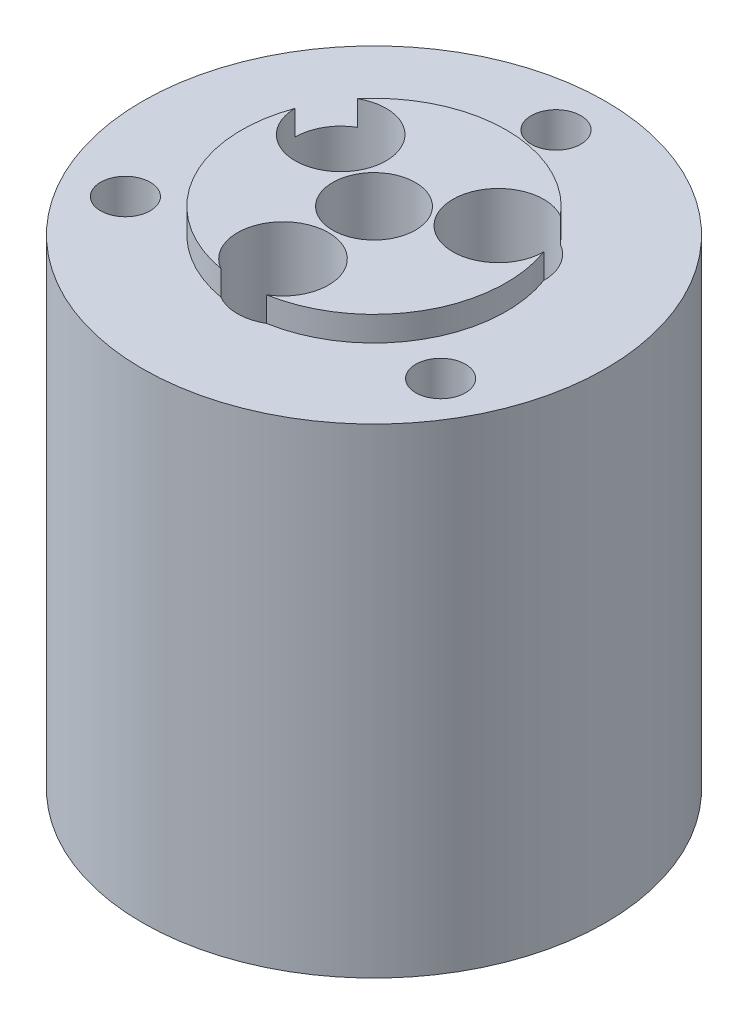
ISO-10303-21;
HEADER;
FILE_DESCRIPTION(('STEP AP214'),'2;1');
FILE_NAME('part.step','',(''),(''),'','','');
FILE_SCHEMA(('AUTOMOTIVE_DESIGN { 1 0 10303 214 1 1 1 1 }'));
ENDSEC;
DATA;
#1=APPLICATION_CONTEXT('core data for automotive mechanical design processes');
#2=APPLICATION_PROTOCOL_DEFINITION('international standard','automotive_design',2000,#1);
#3=PRODUCT_CONTEXT('',#1,'mechanical');
#4=PRODUCT('Part','Part','',(#3));
#5=PRODUCT_RELATED_PRODUCT_CATEGORY('part','',(#4));
#6=PRODUCT_DEFINITION_FORMATION('','',#4);
#7=PRODUCT_DEFINITION_CONTEXT('part definition',#1,'design');
#8=PRODUCT_DEFINITION('design','',#6,#7);
#9=PRODUCT_DEFINITION_SHAPE('','',#8);
#10=(LENGTH_UNIT() NAMED_UNIT(*) SI_UNIT(.MILLI.,.METRE.));
#11=(NAMED_UNIT(*) PLANE_ANGLE_UNIT() SI_UNIT($,.RADIAN.));
#12=(NAMED_UNIT(*) SI_UNIT($,.STERADIAN.) SOLID_ANGLE_UNIT());
#13=UNCERTAINTY_MEASURE_WITH_UNIT(LENGTH_MEASURE(1.E-05),#10,'distance_accuracy_value','');
#14=(GEOMETRIC_REPRESENTATION_CONTEXT(3) GLOBAL_UNCERTAINTY_ASSIGNED_CONTEXT((#13)) GLOBAL_UNIT_ASSIGNED_CONTEXT((#10,
#11,#12)) REPRESENTATION_CONTEXT('',''));
#15=CARTESIAN_POINT('',(0.,0.,0.));
#16=DIRECTION('',(0.,0.,1.));
#17=DIRECTION('',(1.,0.,0.));
#18=AXIS2_PLACEMENT_3D('',#15,#16,#17);
#19=CARTESIAN_POINT('',(0.,0.,0.));
#20=DIRECTION('',(0.,-1.,0.));
#21=DIRECTION('',(1.,0.,0.));
#22=AXIS2_PLACEMENT_3D('',#19,#20,#21);
#23=CYLINDRICAL_SURFACE('',#22,2.5);
#24=CARTESIAN_POINT('',(0.,32.,0.));
#25=DIRECTION('',(0.,-1.,0.));
#26=DIRECTION('',(1.,0.,0.));
#27=AXIS2_PLACEMENT_3D('',#24,#25,#26);
#28=CIRCLE('',#27,2.5);
#29=CARTESIAN_POINT('',(2.5,32.,0.));
#30=VERTEX_POINT('',#29);
#31=EDGE_CURVE('E108',#30,#30,#28,.T.);
#32=ORIENTED_EDGE('',*,*,#31,.F.);
#33=EDGE_LOOP('',(#32));
#34=FACE_BOUND('',#33,.T.);
#35=CARTESIAN_POINT('',(0.,8.,0.));
#36=DIRECTION('',(0.,-1.,0.));
#37=DIRECTION('',(1.,0.,0.));
#38=AXIS2_PLACEMENT_3D('',#35,#36,#37);
#39=CIRCLE('',#38,2.5);
#40=CARTESIAN_POINT('',(2.5,8.,0.));
#41=VERTEX_POINT('',#40);
#42=EDGE_CURVE('E177',#41,#41,#39,.T.);
#43=ORIENTED_EDGE('',*,*,#42,.T.);
#44=EDGE_LOOP('',(#43));
#45=FACE_BOUND('',#44,.T.);
#46=ADVANCED_FACE('F33',(#34,#45),#23,.F.);
#47=CARTESIAN_POINT('',(0.,-0.00100000000000339,5.5));
#48=DIRECTION('',(0.,1.,0.));
#49=DIRECTION('',(-1.,0.,0.));
#50=AXIS2_PLACEMENT_3D('',#47,#48,#49);
#51=CYLINDRICAL_SURFACE('',#50,1.5);
#52=CARTESIAN_POINT('',(0.,12.,5.5));
#53=DIRECTION('',(0.,-1.,0.));
#54=DIRECTION('',(1.,0.,0.));
#55=AXIS2_PLACEMENT_3D('',#52,#53,#54);
#56=CIRCLE('',#55,1.5);
#57=CARTESIAN_POINT('',(-1.5,12.,5.5));
#58=VERTEX_POINT('',#57);
#59=EDGE_CURVE('E156',#58,#58,#56,.T.);
#60=CARTESIAN_POINT('',(0.,8.,5.5));
#61=DIRECTION('',(0.,-1.,0.));
#62=DIRECTION('',(1.,0.,0.));
#63=AXIS2_PLACEMENT_3D('',#60,#61,#62);
#64=CIRCLE('',#63,1.5);
#65=CARTESIAN_POINT('',(-1.5,8.,5.5));
#66=VERTEX_POINT('',#65);
#67=EDGE_CURVE('E180',#66,#66,#64,.T.);
#68=CARTESIAN_POINT('',(-1.5,12.,5.5));
#69=CARTESIAN_POINT('',(-1.5,11.9583333333333,5.5));
#70=CARTESIAN_POINT('',(-1.5,11.9166666666667,5.5));
#71=CARTESIAN_POINT('',(-1.5,11.8333333333333,5.5));
#72=CARTESIAN_POINT('',(-1.5,11.7916666666667,5.5));
#73=CARTESIAN_POINT('',(-1.5,11.7083333333333,5.5));
#74=CARTESIAN_POINT('',(-1.5,11.6666666666667,5.5));
#75=CARTESIAN_POINT('',(-1.5,11.5833333333333,5.5));
#76=CARTESIAN_POINT('',(-1.5,11.5416666666667,5.5));
#77=CARTESIAN_POINT('',(-1.5,11.4583333333333,5.5));
#78=CARTESIAN_POINT('',(-1.5,11.4166666666667,5.5));
#79=CARTESIAN_POINT('',(-1.5,11.3333333333333,5.5));
#80=CARTESIAN_POINT('',(-1.5,11.2916666666667,5.5));
#81=CARTESIAN_POINT('',(-1.5,11.2083333333333,5.5));
#82=CARTESIAN_POINT('',(-1.5,11.1666666666667,5.5));
#83=CARTESIAN_POINT('',(-1.5,11.0833333333333,5.5));
#84=CARTESIAN_POINT('',(-1.5,11.0416666666667,5.5));
#85=CARTESIAN_POINT('',(-1.5,10.9583333333333,5.5));
#86=CARTESIAN_POINT('',(-1.5,10.9166666666667,5.5));
#87=CARTESIAN_POINT('',(-1.5,10.8333333333333,5.5));
#88=CARTESIAN_POINT('',(-1.5,10.7916666666667,5.5));
#89=CARTESIAN_POINT('',(-1.5,10.7083333333333,5.5));
#90=CARTESIAN_POINT('',(-1.5,10.6666666666667,5.5));
#91=CARTESIAN_POINT('',(-1.5,10.5833333333333,5.5));
#92=CARTESIAN_POINT('',(-1.5,10.5416666666667,5.5));
#93=CARTESIAN_POINT('',(-1.5,10.4583333333333,5.5));
#94=CARTESIAN_POINT('',(-1.5,10.4166666666667,5.5));
#95=CARTESIAN_POINT('',(-1.5,10.3333333333333,5.5));
#96=CARTESIAN_POINT('',(-1.5,10.2916666666667,5.5));
#97=CARTESIAN_POINT('',(-1.5,10.2083333333333,5.5));
#98=CARTESIAN_POINT('',(-1.5,10.1666666666667,5.5));
#99=CARTESIAN_POINT('',(-1.5,10.0833333333333,5.5));
#100=CARTESIAN_POINT('',(-1.5,10.0416666666667,5.5));
#101=CARTESIAN_POINT('',(-1.5,9.95833333333333,5.5));
#102=CARTESIAN_POINT('',(-1.5,9.91666666666667,5.5));
#103=CARTESIAN_POINT('',(-1.5,9.83333333333333,5.5));
#104=CARTESIAN_POINT('',(-1.5,9.79166666666667,5.5));
#105=CARTESIAN_POINT('',(-1.5,9.70833333333333,5.5));
#106=CARTESIAN_POINT('',(-1.5,9.66666666666667,5.5));
#107=CARTESIAN_POINT('',(-1.5,9.58333333333333,5.5));
#108=CARTESIAN_POINT('',(-1.5,9.54166666666667,5.5));
#109=CARTESIAN_POINT('',(-1.5,9.45833333333333,5.5));
#110=CARTESIAN_POINT('',(-1.5,9.41666666666667,5.5));
#111=CARTESIAN_POINT('',(-1.5,9.33333333333333,5.5));
#112=CARTESIAN_POINT('',(-1.5,9.29166666666667,5.5));
#113=CARTESIAN_POINT('',(-1.5,9.20833333333333,5.5));
#114=CARTESIAN_POINT('',(-1.5,9.16666666666667,5.5));
#115=CARTESIAN_POINT('',(-1.5,9.08333333333333,5.5));
#116=CARTESIAN_POINT('',(-1.5,9.04166666666667,5.5));
#117=CARTESIAN_POINT('',(-1.5,8.95833333333333,5.5));
#118=CARTESIAN_POINT('',(-1.5,8.91666666666667,5.5));
#119=CARTESIAN_POINT('',(-1.5,8.83333333333333,5.5));
#120=CARTESIAN_POINT('',(-1.5,8.79166666666667,5.5));
#121=CARTESIAN_POINT('',(-1.5,8.70833333333333,5.5));
#122=CARTESIAN_POINT('',(-1.5,8.66666666666667,5.5));
#123=CARTESIAN_POINT('',(-1.5,8.58333333333333,5.5));
#124=CARTESIAN_POINT('',(-1.5,8.54166666666667,5.5));
#125=CARTESIAN_POINT('',(-1.5,8.45833333333333,5.5));
#126=CARTESIAN_POINT('',(-1.5,8.41666666666667,5.5));
#127=CARTESIAN_POINT('',(-1.5,8.33333333333333,5.5));
#128=CARTESIAN_POINT('',(-1.5,8.29166666666667,5.5));
#129=CARTESIAN_POINT('',(-1.5,8.20833333333333,5.5));
#130=CARTESIAN_POINT('',(-1.5,8.16666666666667,5.5));
#131=CARTESIAN_POINT('',(-1.5,8.08333333333333,5.5));
#132=CARTESIAN_POINT('',(-1.5,8.04166666666667,5.5));
#133=CARTESIAN_POINT('',(-1.5,8.,5.5));
#134=B_SPLINE_CURVE_WITH_KNOTS('',3,(#68,#69,#70,#71,#72,#73,#74,#75,#76,#77,#78,#79,#80,#81,
#82,#83,#84,#85,#86,#87,#88,#89,#90,#91,#92,#93,#94,#95,#96,#97,#98,#99,#100,#101,#102,#103,
#104,#105,#106,#107,#108,#109,#110,#111,#112,#113,#114,#115,#116,#117,#118,#119,#120,#121,#122,
#123,#124,#125,#126,#127,#128,#129,#130,#131,#132,#133),.UNSPECIFIED.,.F.,.F.,(4,2,2,2,2,2,2,2,
2,2,2,2,2,2,2,2,2,2,2,2,2,2,2,2,2,2,2,2,2,2,2,2,4),(0.,0.125,0.25,0.375,0.5,0.625000000000001,
0.750000000000001,0.875000000000001,1.,1.125,1.25,1.375,1.5,1.625,1.75,1.875,2.,2.125,2.25,
2.375,2.5,2.625,2.75,2.875,3.,3.125,3.25,3.375,3.5,3.625,3.75,3.875,4.),.UNSPECIFIED.);
#135=EDGE_CURVE('BSEAM209',#58,#66,#134,.T.);
#136=ORIENTED_EDGE('',*,*,#59,.F.);
#137=ORIENTED_EDGE('',*,*,#67,.T.);
#138=ORIENTED_EDGE('',*,*,#135,.T.);
#139=ORIENTED_EDGE('',*,*,#135,.F.);
#140=EDGE_LOOP('',(#136,#138,#137,#139));
#141=FACE_BOUND('',#140,.T.);
#142=ADVANCED_FACE('F209',(#141),#51,.F.);
#143=CARTESIAN_POINT('',(4.76313972081473,-0.00100000000000273,-2.74999999999981));
#144=DIRECTION('',(0.,1.,0.));
#145=DIRECTION('',(-1.,0.,0.));
#146=AXIS2_PLACEMENT_3D('',#143,#144,#145);
#147=CYLINDRICAL_SURFACE('',#146,1.5);
#148=CARTESIAN_POINT('',(4.76313972081473,12.,-2.74999999999981));
#149=DIRECTION('',(0.,-1.,0.));
#150=DIRECTION('',(1.,0.,0.));
#151=AXIS2_PLACEMENT_3D('',#148,#149,#150);
#152=CIRCLE('',#151,1.5);
#153=CARTESIAN_POINT('',(3.26313972081473,12.,-2.74999999999981));
#154=VERTEX_POINT('',#153);
#155=EDGE_CURVE('E166',#154,#154,#152,.T.);
#156=CARTESIAN_POINT('',(4.76313972081473,8.,-2.74999999999981));
#157=DIRECTION('',(0.,-1.,0.));
#158=DIRECTION('',(1.,0.,0.));
#159=AXIS2_PLACEMENT_3D('',#156,#157,#158);
#160=CIRCLE('',#159,1.5);
#161=CARTESIAN_POINT('',(3.26313972081473,8.,-2.74999999999981));
#162=VERTEX_POINT('',#161);
#163=EDGE_CURVE('E183',#162,#162,#160,.T.);
#164=CARTESIAN_POINT('',(3.26313972081473,12.,-2.74999999999981));
#165=CARTESIAN_POINT('',(3.26313972081473,11.9583333333333,-2.74999999999981));
#166=CARTESIAN_POINT('',(3.26313972081473,11.9166666666667,-2.74999999999981));
#167=CARTESIAN_POINT('',(3.26313972081473,11.8333333333333,-2.74999999999981));
#168=CARTESIAN_POINT('',(3.26313972081473,11.7916666666667,-2.74999999999981));
#169=CARTESIAN_POINT('',(3.26313972081473,11.7083333333333,-2.74999999999981));
#170=CARTESIAN_POINT('',(3.26313972081473,11.6666666666667,-2.74999999999981));
#171=CARTESIAN_POINT('',(3.26313972081473,11.5833333333333,-2.74999999999981));
#172=CARTESIAN_POINT('',(3.26313972081473,11.5416666666667,-2.74999999999981));
#173=CARTESIAN_POINT('',(3.26313972081473,11.4583333333333,-2.74999999999981));
#174=CARTESIAN_POINT('',(3.26313972081473,11.4166666666667,-2.74999999999981));
#175=CARTESIAN_POINT('',(3.26313972081473,11.3333333333333,-2.74999999999981));
#176=CARTESIAN_POINT('',(3.26313972081473,11.2916666666667,-2.74999999999981));
#177=CARTESIAN_POINT('',(3.26313972081473,11.2083333333333,-2.74999999999981));
#178=CARTESIAN_POINT('',(3.26313972081473,11.1666666666667,-2.74999999999981));
#179=CARTESIAN_POINT('',(3.26313972081473,11.0833333333333,-2.74999999999981));
#180=CARTESIAN_POINT('',(3.26313972081473,11.0416666666667,-2.74999999999981));
#181=CARTESIAN_POINT('',(3.26313972081473,10.9583333333333,-2.74999999999981));
#182=CARTESIAN_POINT('',(3.26313972081473,10.9166666666667,-2.74999999999981));
#183=CARTESIAN_POINT('',(3.26313972081473,10.8333333333333,-2.74999999999981));
#184=CARTESIAN_POINT('',(3.26313972081473,10.7916666666667,-2.74999999999981));
#185=CARTESIAN_POINT('',(3.26313972081473,10.7083333333333,-2.74999999999981));
#186=CARTESIAN_POINT('',(3.26313972081473,10.6666666666667,-2.74999999999981));
#187=CARTESIAN_POINT('',(3.26313972081473,10.5833333333333,-2.74999999999981));
#188=CARTESIAN_POINT('',(3.26313972081473,10.5416666666667,-2.74999999999981));
#189=CARTESIAN_POINT('',(3.26313972081473,10.4583333333333,-2.74999999999981));
#190=CARTESIAN_POINT('',(3.26313972081473,10.4166666666667,-2.74999999999981));
#191=CARTESIAN_POINT('',(3.26313972081473,10.3333333333333,-2.74999999999981));
#192=CARTESIAN_POINT('',(3.26313972081473,10.2916666666667,-2.74999999999981));
#193=CARTESIAN_POINT('',(3.26313972081473,10.2083333333333,-2.74999999999981));
#194=CARTESIAN_POINT('',(3.26313972081473,10.1666666666667,-2.74999999999981));
#195=CARTESIAN_POINT('',(3.26313972081473,10.0833333333333,-2.74999999999981));
#196=CARTESIAN_POINT('',(3.26313972081473,10.0416666666667,-2.74999999999981));
#197=CARTESIAN_POINT('',(3.26313972081473,9.95833333333333,-2.74999999999981));
#198=CARTESIAN_POINT('',(3.26313972081473,9.91666666666667,-2.74999999999981));
#199=CARTESIAN_POINT('',(3.26313972081473,9.83333333333333,-2.74999999999981));
#200=CARTESIAN_POINT('',(3.26313972081473,9.79166666666667,-2.74999999999981));
#201=CARTESIAN_POINT('',(3.26313972081473,9.70833333333333,-2.74999999999981));
#202=CARTESIAN_POINT('',(3.26313972081473,9.66666666666667,-2.74999999999981));
#203=CARTESIAN_POINT('',(3.26313972081473,9.58333333333333,-2.74999999999981));
#204=CARTESIAN_POINT('',(3.26313972081473,9.54166666666667,-2.74999999999981));
#205=CARTESIAN_POINT('',(3.26313972081473,9.45833333333333,-2.74999999999981));
#206=CARTESIAN_POINT('',(3.26313972081473,9.41666666666667,-2.74999999999981));
#207=CARTESIAN_POINT('',(3.26313972081473,9.33333333333333,-2.74999999999981));
#208=CARTESIAN_POINT('',(3.26313972081473,9.29166666666667,-2.74999999999981));
#209=CARTESIAN_POINT('',(3.26313972081473,9.20833333333333,-2.74999999999981));
#210=CARTESIAN_POINT('',(3.26313972081473,9.16666666666667,-2.74999999999981));
#211=CARTESIAN_POINT('',(3.26313972081473,9.08333333333333,-2.74999999999981));
#212=CARTESIAN_POINT('',(3.26313972081473,9.04166666666667,-2.74999999999981));
#213=CARTESIAN_POINT('',(3.26313972081473,8.95833333333333,-2.74999999999981));
#214=CARTESIAN_POINT('',(3.26313972081473,8.91666666666667,-2.74999999999981));
#215=CARTESIAN_POINT('',(3.26313972081473,8.83333333333333,-2.74999999999981));
#216=CARTESIAN_POINT('',(3.26313972081473,8.79166666666667,-2.74999999999981));
#217=CARTESIAN_POINT('',(3.26313972081473,8.70833333333333,-2.74999999999981));
#218=CARTESIAN_POINT('',(3.26313972081473,8.66666666666667,-2.74999999999981));
#219=CARTESIAN_POINT('',(3.26313972081473,8.58333333333333,-2.74999999999981));
#220=CARTESIAN_POINT('',(3.26313972081473,8.54166666666667,-2.74999999999981));
#221=CARTESIAN_POINT('',(3.26313972081473,8.45833333333333,-2.74999999999981));
#222=CARTESIAN_POINT('',(3.26313972081473,8.41666666666667,-2.74999999999981));
#223=CARTESIAN_POINT('',(3.26313972081473,8.33333333333333,-2.74999999999981));
#224=CARTESIAN_POINT('',(3.26313972081473,8.29166666666667,-2.74999999999981));
#225=CARTESIAN_POINT('',(3.26313972081473,8.20833333333333,-2.74999999999981));
#226=CARTESIAN_POINT('',(3.26313972081473,8.16666666666667,-2.74999999999981));
#227=CARTESIAN_POINT('',(3.26313972081473,8.08333333333333,-2.74999999999981));
#228=CARTESIAN_POINT('',(3.26313972081473,8.04166666666667,-2.74999999999981));
#229=CARTESIAN_POINT('',(3.26313972081473,8.,-2.74999999999981));
#230=B_SPLINE_CURVE_WITH_KNOTS('',3,(#164,#165,#166,#167,#168,#169,#170,#171,#172,#173,#174,
#175,#176,#177,#178,#179,#180,#181,#182,#183,#184,#185,#186,#187,#188,#189,#190,#191,#192,#193,
#194,#195,#196,#197,#198,#199,#200,#201,#202,#203,#204,#205,#206,#207,#208,#209,#210,#211,#212,
#213,#214,#215,#216,#217,#218,#219,#220,#221,#222,#223,#224,#225,#226,#227,#228,#229),
.UNSPECIFIED.,.F.,.F.,(4,2,2,2,2,2,2,2,2,2,2,2,2,2,2,2,2,2,2,2,2,2,2,2,2,2,2,2,2,2,2,2,4),(0.,
0.125,0.25,0.375,0.5,0.625000000000001,0.750000000000001,0.875000000000001,1.,1.125,1.25,1.375,
1.5,1.625,1.75,1.875,2.,2.125,2.25,2.375,2.5,2.625,2.75,2.875,3.,3.125,3.25,3.375,3.5,3.625,
3.75,3.875,4.),.UNSPECIFIED.);
#231=EDGE_CURVE('BSEAM214',#154,#162,#230,.T.);
#232=ORIENTED_EDGE('',*,*,#155,.F.);
#233=ORIENTED_EDGE('',*,*,#163,.T.);
#234=ORIENTED_EDGE('',*,*,#231,.T.);
#235=ORIENTED_EDGE('',*,*,#231,.F.);
#236=EDGE_LOOP('',(#232,#234,#233,#235));
#237=FACE_BOUND('',#236,.T.);
#238=ADVANCED_FACE('F214',(#237),#147,.F.);
#239=CARTESIAN_POINT('',(-4.76313972081409,-0.00100000000000404,-2.75000000000019));
#240=DIRECTION('',(0.,1.,0.));
#241=DIRECTION('',(-1.,0.,0.));
#242=AXIS2_PLACEMENT_3D('',#239,#240,#241);
#243=CYLINDRICAL_SURFACE('',#242,1.5);
#244=CARTESIAN_POINT('',(-4.76313972081409,12.,-2.75000000000019));
#245=DIRECTION('',(0.,-1.,0.));
#246=DIRECTION('',(1.,0.,0.));
#247=AXIS2_PLACEMENT_3D('',#244,#245,#246);
#248=CIRCLE('',#247,1.5);
#249=CARTESIAN_POINT('',(-6.26313972081409,12.,-2.75000000000019));
#250=VERTEX_POINT('',#249);
#251=EDGE_CURVE('E92',#250,#250,#248,.T.);
#252=CARTESIAN_POINT('',(-4.76313972081409,8.,-2.75000000000019));
#253=DIRECTION('',(0.,-1.,0.));
#254=DIRECTION('',(1.,0.,0.));
#255=AXIS2_PLACEMENT_3D('',#252,#253,#254);
#256=CIRCLE('',#255,1.5);
#257=CARTESIAN_POINT('',(-6.26313972081409,8.,-2.75000000000019));
#258=VERTEX_POINT('',#257);
#259=EDGE_CURVE('E36',#258,#258,#256,.T.);
#260=CARTESIAN_POINT('',(-6.26313972081409,12.,-2.75000000000019));
#261=CARTESIAN_POINT('',(-6.26313972081409,11.9583333333333,-2.75000000000019));
#262=CARTESIAN_POINT('',(-6.26313972081409,11.9166666666667,-2.75000000000019));
#263=CARTESIAN_POINT('',(-6.26313972081409,11.8333333333333,-2.75000000000019));
#264=CARTESIAN_POINT('',(-6.26313972081409,11.7916666666667,-2.75000000000019));
#265=CARTESIAN_POINT('',(-6.26313972081409,11.7083333333333,-2.75000000000019));
#266=CARTESIAN_POINT('',(-6.26313972081409,11.6666666666667,-2.75000000000019));
#267=CARTESIAN_POINT('',(-6.26313972081409,11.5833333333333,-2.75000000000019));
#268=CARTESIAN_POINT('',(-6.26313972081409,11.5416666666667,-2.75000000000019));
#269=CARTESIAN_POINT('',(-6.26313972081409,11.4583333333333,-2.75000000000019));
#270=CARTESIAN_POINT('',(-6.26313972081409,11.4166666666667,-2.75000000000019));
#271=CARTESIAN_POINT('',(-6.26313972081409,11.3333333333333,-2.75000000000019));
#272=CARTESIAN_POINT('',(-6.26313972081409,11.2916666666667,-2.75000000000019));
#273=CARTESIAN_POINT('',(-6.26313972081409,11.2083333333333,-2.75000000000019));
#274=CARTESIAN_POINT('',(-6.26313972081409,11.1666666666667,-2.75000000000019));
#275=CARTESIAN_POINT('',(-6.26313972081409,11.0833333333333,-2.75000000000019));
#276=CARTESIAN_POINT('',(-6.26313972081409,11.0416666666667,-2.75000000000019));
#277=CARTESIAN_POINT('',(-6.26313972081409,10.9583333333333,-2.75000000000019));
#278=CARTESIAN_POINT('',(-6.26313972081409,10.9166666666667,-2.75000000000019));
#279=CARTESIAN_POINT('',(-6.26313972081409,10.8333333333333,-2.75000000000019));
#280=CARTESIAN_POINT('',(-6.26313972081409,10.7916666666667,-2.75000000000019));
#281=CARTESIAN_POINT('',(-6.26313972081409,10.7083333333333,-2.75000000000019));
#282=CARTESIAN_POINT('',(-6.26313972081409,10.6666666666667,-2.75000000000019));
#283=CARTESIAN_POINT('',(-6.26313972081409,10.5833333333333,-2.75000000000019));
#284=CARTESIAN_POINT('',(-6.26313972081409,10.5416666666667,-2.75000000000019));
#285=CARTESIAN_POINT('',(-6.26313972081409,10.4583333333333,-2.75000000000019));
#286=CARTESIAN_POINT('',(-6.26313972081409,10.4166666666667,-2.75000000000019));
#287=CARTESIAN_POINT('',(-6.26313972081409,10.3333333333333,-2.75000000000019));
#288=CARTESIAN_POINT('',(-6.26313972081409,10.2916666666667,-2.75000000000019));
#289=CARTESIAN_POINT('',(-6.26313972081409,10.2083333333333,-2.75000000000019));
#290=CARTESIAN_POINT('',(-6.26313972081409,10.1666666666667,-2.75000000000019));
#291=CARTESIAN_POINT('',(-6.26313972081409,10.0833333333333,-2.75000000000019));
#292=CARTESIAN_POINT('',(-6.26313972081409,10.0416666666667,-2.75000000000019));
#293=CARTESIAN_POINT('',(-6.26313972081409,9.95833333333333,-2.75000000000019));
#294=CARTESIAN_POINT('',(-6.26313972081409,9.91666666666667,-2.75000000000019));
#295=CARTESIAN_POINT('',(-6.26313972081409,9.83333333333333,-2.75000000000019));
#296=CARTESIAN_POINT('',(-6.26313972081409,9.79166666666667,-2.75000000000019));
#297=CARTESIAN_POINT('',(-6.26313972081409,9.70833333333333,-2.75000000000019));
#298=CARTESIAN_POINT('',(-6.26313972081409,9.66666666666667,-2.75000000000019));
#299=CARTESIAN_POINT('',(-6.26313972081409,9.58333333333333,-2.75000000000019));
#300=CARTESIAN_POINT('',(-6.26313972081409,9.54166666666667,-2.75000000000019));
#301=CARTESIAN_POINT('',(-6.26313972081409,9.45833333333333,-2.75000000000019));
#302=CARTESIAN_POINT('',(-6.26313972081409,9.41666666666667,-2.75000000000019));
#303=CARTESIAN_POINT('',(-6.26313972081409,9.33333333333333,-2.75000000000019));
#304=CARTESIAN_POINT('',(-6.26313972081409,9.29166666666666,-2.75000000000019));
#305=CARTESIAN_POINT('',(-6.26313972081409,9.20833333333333,-2.75000000000019));
#306=CARTESIAN_POINT('',(-6.26313972081409,9.16666666666667,-2.75000000000019));
#307=CARTESIAN_POINT('',(-6.26313972081409,9.08333333333333,-2.75000000000019));
#308=CARTESIAN_POINT('',(-6.26313972081409,9.04166666666667,-2.75000000000019));
#309=CARTESIAN_POINT('',(-6.26313972081409,8.95833333333333,-2.75000000000019));
#310=CARTESIAN_POINT('',(-6.26313972081409,8.91666666666667,-2.75000000000019));
#311=CARTESIAN_POINT('',(-6.26313972081409,8.83333333333333,-2.75000000000019));
#312=CARTESIAN_POINT('',(-6.26313972081409,8.79166666666667,-2.75000000000019));
#313=CARTESIAN_POINT('',(-6.26313972081409,8.70833333333333,-2.75000000000019));
#314=CARTESIAN_POINT('',(-6.26313972081409,8.66666666666667,-2.75000000000019));
#315=CARTESIAN_POINT('',(-6.26313972081409,8.58333333333333,-2.75000000000019));
#316=CARTESIAN_POINT('',(-6.26313972081409,8.54166666666667,-2.75000000000019));
#317=CARTESIAN_POINT('',(-6.26313972081409,8.45833333333333,-2.75000000000019));
#318=CARTESIAN_POINT('',(-6.26313972081409,8.41666666666667,-2.75000000000019));
#319=CARTESIAN_POINT('',(-6.26313972081409,8.33333333333333,-2.75000000000019));
#320=CARTESIAN_POINT('',(-6.26313972081409,8.29166666666667,-2.75000000000019));
#321=CARTESIAN_POINT('',(-6.26313972081409,8.20833333333333,-2.75000000000019));
#322=CARTESIAN_POINT('',(-6.26313972081409,8.16666666666667,-2.75000000000019));
#323=CARTESIAN_POINT('',(-6.26313972081409,8.08333333333333,-2.75000000000019));
#324=CARTESIAN_POINT('',(-6.26313972081409,8.04166666666667,-2.75000000000019));
#325=CARTESIAN_POINT('',(-6.26313972081409,8.,-2.75000000000019));
#326=B_SPLINE_CURVE_WITH_KNOTS('',3,(#260,#261,#262,#263,#264,#265,#266,#267,#268,#269,#270,
#271,#272,#273,#274,#275,#276,#277,#278,#279,#280,#281,#282,#283,#284,#285,#286,#287,#288,#289,
#290,#291,#292,#293,#294,#295,#296,#297,#298,#299,#300,#301,#302,#303,#304,#305,#306,#307,#308,
#309,#310,#311,#312,#313,#314,#315,#316,#317,#318,#319,#320,#321,#322,#323,#324,#325),
.UNSPECIFIED.,.F.,.F.,(4,2,2,2,2,2,2,2,2,2,2,2,2,2,2,2,2,2,2,2,2,2,2,2,2,2,2,2,2,2,2,2,4),(0.,
0.125,0.25,0.375,0.5,0.625000000000001,0.750000000000001,0.875000000000001,1.,1.125,1.25,1.375,
1.5,1.625,1.75,1.875,2.,2.125,2.25,2.375,2.5,2.625,2.75,2.875,3.,3.125,3.25,3.375,3.5,3.625,
3.75,3.875,4.),.UNSPECIFIED.);
#327=EDGE_CURVE('BSEAM193',#250,#258,#326,.T.);
#328=ORIENTED_EDGE('',*,*,#251,.F.);
#329=ORIENTED_EDGE('',*,*,#259,.T.);
#330=ORIENTED_EDGE('',*,*,#327,.T.);
#331=ORIENTED_EDGE('',*,*,#327,.F.);
#332=EDGE_LOOP('',(#328,#330,#329,#331));
#333=FACE_BOUND('',#332,.T.);
#334=ADVANCED_FACE('F193',(#333),#243,.F.);
#335=CARTESIAN_POINT('',(8.,32.,0.));
#336=DIRECTION('',(0.,1.,0.));
#337=DIRECTION('',(-1.,0.,0.));
#338=AXIS2_PLACEMENT_3D('',#335,#336,#337);
#339=PLANE('',#338);
#340=ORIENTED_EDGE('',*,*,#31,.T.);
#341=EDGE_LOOP('',(#340));
#342=FACE_BOUND('',#341,.T.);
#343=CARTESIAN_POINT('',(0.,32.,0.));
#344=DIRECTION('',(0.,-1.,0.));
#345=DIRECTION('',(1.,0.,0.));
#346=AXIS2_PLACEMENT_3D('',#343,#344,#345);
#347=CIRCLE('',#346,8.);
#348=CARTESIAN_POINT('',(-6.13660215946123,32.,-5.1324569103399));
#349=VERTEX_POINT('',#348);
#350=CARTESIAN_POINT('',(6.13660215946123,32.,-5.1324569103399));
#351=VERTEX_POINT('',#350);
#352=EDGE_CURVE('E101',#349,#351,#347,.T.);
#353=ORIENTED_EDGE('',*,*,#352,.F.);
#354=CARTESIAN_POINT('',(-4.7631397208141,32.,-2.75000000000019));
#355=DIRECTION('',(0.,-1.,0.));
#356=DIRECTION('',(1.,0.,0.));
#357=AXIS2_PLACEMENT_3D('',#354,#355,#356);
#358=CIRCLE('',#357,2.75);
#359=CARTESIAN_POINT('',(-7.51313914791364,32.,-2.74822490784279));
#360=VERTEX_POINT('',#359);
#361=EDGE_CURVE('E87',#349,#360,#358,.T.);
#362=ORIENTED_EDGE('',*,*,#361,.T.);
#363=CARTESIAN_POINT('',(-1.37653698845273,32.,7.88068181818182));
#364=VERTEX_POINT('',#363);
#365=EDGE_CURVE('E99',#364,#360,#347,.T.);
#366=ORIENTED_EDGE('',*,*,#365,.F.);
#367=CARTESIAN_POINT('',(0.,32.,5.5));
#368=DIRECTION('',(0.,-1.,0.));
#369=DIRECTION('',(1.,0.,0.));
#370=AXIS2_PLACEMENT_3D('',#367,#368,#369);
#371=CIRCLE('',#370,2.75);
#372=CARTESIAN_POINT('',(1.37653698845273,32.,7.88068181818182));
#373=VERTEX_POINT('',#372);
#374=EDGE_CURVE('E157',#364,#373,#371,.T.);
#375=ORIENTED_EDGE('',*,*,#374,.T.);
#376=CARTESIAN_POINT('',(7.51313914791427,32.,-2.74822490784105));
#377=VERTEX_POINT('',#376);
#378=EDGE_CURVE('E110',#377,#373,#347,.T.);
#379=ORIENTED_EDGE('',*,*,#378,.F.);
#380=CARTESIAN_POINT('',(4.76313972081473,32.,-2.74999999999981));
#381=DIRECTION('',(0.,-1.,0.));
#382=DIRECTION('',(1.,0.,0.));
#383=AXIS2_PLACEMENT_3D('',#380,#381,#382);
#384=CIRCLE('',#383,2.75);
#385=EDGE_CURVE('E167',#377,#351,#384,.T.);
#386=ORIENTED_EDGE('',*,*,#385,.T.);
#387=EDGE_LOOP('',(#353,#362,#366,#375,#379,#386));
#388=FACE_BOUND('',#387,.T.);
#389=ADVANCED_FACE('F97',(#342,#388),#339,.T.);
#390=CARTESIAN_POINT('',(0.,0.,0.));
#391=DIRECTION('',(0.,-1.,0.));
#392=DIRECTION('',(1.,0.,0.));
#393=AXIS2_PLACEMENT_3D('',#390,#391,#392);
#394=CYLINDRICAL_SURFACE('',#393,8.);
#395=CARTESIAN_POINT('',(0.,30.5,0.));
#396=DIRECTION('',(0.,-1.,0.));
#397=DIRECTION('',(1.,0.,0.));
#398=AXIS2_PLACEMENT_3D('',#395,#396,#397);
#399=CIRCLE('',#398,8.);
#400=CARTESIAN_POINT('',(-6.13660215946123,30.5,-5.1324569103399));
#401=VERTEX_POINT('',#400);
#402=CARTESIAN_POINT('',(6.13660215946123,30.5,-5.1324569103399));
#403=VERTEX_POINT('',#402);
#404=EDGE_CURVE('E120',#401,#403,#399,.T.);
#405=ORIENTED_EDGE('',*,*,#404,.F.);
#406=DIRECTION('',(0.,1.,0.));
#407=VECTOR('',#406,1.);
#408=CARTESIAN_POINT('',(-6.13660215946123,22.,-5.1324569103399));
#409=LINE('',#408,#407);
#410=EDGE_CURVE('E48',#401,#349,#409,.T.);
#411=ORIENTED_EDGE('',*,*,#410,.T.);
#412=ORIENTED_EDGE('',*,*,#352,.T.);
#413=DIRECTION('',(0.,1.,0.));
#414=VECTOR('',#413,1.);
#415=CARTESIAN_POINT('',(6.13660215946123,22.,-5.1324569103399));
#416=LINE('',#415,#414);
#417=EDGE_CURVE('E163',#351,#403,#416,.F.);
#418=ORIENTED_EDGE('',*,*,#417,.T.);
#419=EDGE_LOOP('',(#405,#411,#412,#418));
#420=FACE_BOUND('',#419,.T.);
#421=ADVANCED_FACE('F221',(#420),#394,.T.);
#422=ORIENTED_EDGE('',*,*,#365,.T.);
#423=DIRECTION('',(0.,1.,0.));
#424=VECTOR('',#423,1.);
#425=CARTESIAN_POINT('',(-7.51313914791364,22.,-2.74822490784279));
#426=LINE('',#425,#424);
#427=CARTESIAN_POINT('',(-7.51313914791364,30.5,-2.74822490784279));
#428=VERTEX_POINT('',#427);
#429=EDGE_CURVE('E84',#360,#428,#426,.F.);
#430=ORIENTED_EDGE('',*,*,#429,.T.);
#431=CARTESIAN_POINT('',(-1.37653698845273,30.5,7.88068181818182));
#432=VERTEX_POINT('',#431);
#433=EDGE_CURVE('E115',#432,#428,#399,.T.);
#434=ORIENTED_EDGE('',*,*,#433,.F.);
#435=DIRECTION('',(0.,1.,0.));
#436=VECTOR('',#435,1.);
#437=CARTESIAN_POINT('',(-1.37653698845273,22.,7.88068181818182));
#438=LINE('',#437,#436);
#439=EDGE_CURVE('E107',#432,#364,#438,.T.);
#440=ORIENTED_EDGE('',*,*,#439,.T.);
#441=EDGE_LOOP('',(#422,#430,#434,#440));
#442=FACE_BOUND('',#441,.T.);
#443=ADVANCED_FACE('F106',(#442),#394,.T.);
#444=CARTESIAN_POINT('',(8.,30.5,0.));
#445=DIRECTION('',(0.,1.,0.));
#446=DIRECTION('',(-1.,0.,0.));
#447=AXIS2_PLACEMENT_3D('',#444,#445,#446);
#448=PLANE('',#447);
#449=CARTESIAN_POINT('',(0.,30.5,0.));
#450=DIRECTION('',(0.,-1.,0.));
#451=DIRECTION('',(1.,0.,0.));
#452=AXIS2_PLACEMENT_3D('',#449,#450,#451);
#453=CIRCLE('',#452,14.);
#454=CARTESIAN_POINT('',(14.,30.5,0.));
#455=VERTEX_POINT('',#454);
#456=EDGE_CURVE('E125',#455,#455,#453,.T.);
#457=ORIENTED_EDGE('',*,*,#456,.F.);
#458=EDGE_LOOP('',(#457));
#459=FACE_BOUND('',#458,.T.);
#460=CARTESIAN_POINT('',(0.,30.5,-11.));
#461=DIRECTION('',(0.,1.,0.));
#462=DIRECTION('',(-1.,0.,0.));
#463=AXIS2_PLACEMENT_3D('',#460,#461,#462);
#464=CIRCLE('',#463,1.5);
#465=CARTESIAN_POINT('',(-1.5,30.5,-11.));
#466=VERTEX_POINT('',#465);
#467=EDGE_CURVE('E136',#466,#466,#464,.T.);
#468=ORIENTED_EDGE('',*,*,#467,.F.);
#469=EDGE_LOOP('',(#468));
#470=FACE_BOUND('',#469,.T.);
#471=CARTESIAN_POINT('',(9.52627944162952,30.5,5.49999999999959));
#472=DIRECTION('',(0.,1.,0.));
#473=DIRECTION('',(-1.,0.,0.));
#474=AXIS2_PLACEMENT_3D('',#471,#472,#473);
#475=CIRCLE('',#474,1.50000000000061);
#476=CARTESIAN_POINT('',(8.02627944162892,30.5,5.49999999999959));
#477=VERTEX_POINT('',#476);
#478=EDGE_CURVE('E142',#477,#477,#475,.T.);
#479=ORIENTED_EDGE('',*,*,#478,.F.);
#480=EDGE_LOOP('',(#479));
#481=FACE_BOUND('',#480,.T.);
#482=CARTESIAN_POINT('',(-9.52627944162812,30.5,5.50000000000041));
#483=DIRECTION('',(0.,1.,0.));
#484=DIRECTION('',(-1.,0.,0.));
#485=AXIS2_PLACEMENT_3D('',#482,#483,#484);
#486=CIRCLE('',#485,1.50000000000089);
#487=CARTESIAN_POINT('',(-11.026279441629,30.5,5.50000000000041));
#488=VERTEX_POINT('',#487);
#489=EDGE_CURVE('E148',#488,#488,#486,.T.);
#490=ORIENTED_EDGE('',*,*,#489,.F.);
#491=EDGE_LOOP('',(#490));
#492=FACE_BOUND('',#491,.T.);
#493=ORIENTED_EDGE('',*,*,#433,.T.);
#494=CARTESIAN_POINT('',(-4.7631397208141,30.5,-2.75000000000019));
#495=DIRECTION('',(0.,1.,0.));
#496=DIRECTION('',(-1.,0.,0.));
#497=AXIS2_PLACEMENT_3D('',#494,#495,#496);
#498=CIRCLE('',#497,2.75);
#499=EDGE_CURVE('E11',#428,#401,#498,.F.);
#500=ORIENTED_EDGE('',*,*,#499,.T.);
#501=ORIENTED_EDGE('',*,*,#404,.T.);
#502=CARTESIAN_POINT('',(4.76313972081473,30.5,-2.74999999999981));
#503=DIRECTION('',(0.,1.,0.));
#504=DIRECTION('',(-1.,0.,0.));
#505=AXIS2_PLACEMENT_3D('',#502,#503,#504);
#506=CIRCLE('',#505,2.75);
#507=CARTESIAN_POINT('',(7.51313914791427,30.5,-2.74822490784105));
#508=VERTEX_POINT('',#507);
#509=EDGE_CURVE('E41',#403,#508,#506,.F.);
#510=ORIENTED_EDGE('',*,*,#509,.T.);
#511=CARTESIAN_POINT('',(1.37653698845273,30.5,7.88068181818182));
#512=VERTEX_POINT('',#511);
#513=EDGE_CURVE('E121',#508,#512,#399,.T.);
#514=ORIENTED_EDGE('',*,*,#513,.T.);
#515=CARTESIAN_POINT('',(0.,30.5,5.5));
#516=DIRECTION('',(0.,1.,0.));
#517=DIRECTION('',(-1.,0.,0.));
#518=AXIS2_PLACEMENT_3D('',#515,#516,#517);
#519=CIRCLE('',#518,2.75);
#520=EDGE_CURVE('E112',#512,#432,#519,.F.);
#521=ORIENTED_EDGE('',*,*,#520,.T.);
#522=EDGE_LOOP('',(#493,#500,#501,#510,#514,#521));
#523=FACE_BOUND('',#522,.T.);
#524=ADVANCED_FACE('F234',(#459,#470,#481,#492,#523),#448,.T.);
#525=ORIENTED_EDGE('',*,*,#513,.F.);
#526=DIRECTION('',(0.,1.,0.));
#527=VECTOR('',#526,1.);
#528=CARTESIAN_POINT('',(7.51313914791427,22.,-2.74822490784105));
#529=LINE('',#528,#527);
#530=EDGE_CURVE('E55',#508,#377,#529,.T.);
#531=ORIENTED_EDGE('',*,*,#530,.T.);
#532=ORIENTED_EDGE('',*,*,#378,.T.);
#533=DIRECTION('',(0.,1.,0.));
#534=VECTOR('',#533,1.);
#535=CARTESIAN_POINT('',(1.37653698845273,22.,7.88068181818182));
#536=LINE('',#535,#534);
#537=EDGE_CURVE('E154',#373,#512,#536,.F.);
#538=ORIENTED_EDGE('',*,*,#537,.T.);
#539=EDGE_LOOP('',(#525,#531,#532,#538));
#540=FACE_BOUND('',#539,.T.);
#541=ADVANCED_FACE('F228',(#540),#394,.T.);
#542=CARTESIAN_POINT('',(0.,0.,0.));
#543=DIRECTION('',(0.,-1.,0.));
#544=DIRECTION('',(1.,0.,0.));
#545=AXIS2_PLACEMENT_3D('',#542,#543,#544);
#546=CYLINDRICAL_SURFACE('',#545,14.);
#547=ORIENTED_EDGE('',*,*,#456,.T.);
#548=EDGE_LOOP('',(#547));
#549=FACE_BOUND('',#548,.T.);
#550=CARTESIAN_POINT('',(0.,1.5,0.));
#551=DIRECTION('',(0.,-1.,0.));
#552=DIRECTION('',(1.,0.,0.));
#553=AXIS2_PLACEMENT_3D('',#550,#551,#552);
#554=CIRCLE('',#553,14.);
#555=CARTESIAN_POINT('',(14.,1.5,0.));
#556=VERTEX_POINT('',#555);
#557=EDGE_CURVE('E129',#556,#556,#554,.T.);
#558=ORIENTED_EDGE('',*,*,#557,.F.);
#559=EDGE_LOOP('',(#558));
#560=FACE_BOUND('',#559,.T.);
#561=ADVANCED_FACE('F233',(#549,#560),#546,.T.);
#562=CARTESIAN_POINT('',(8.,1.5,0.));
#563=DIRECTION('',(0.,-1.,0.));
#564=DIRECTION('',(1.,0.,0.));
#565=AXIS2_PLACEMENT_3D('',#562,#563,#564);
#566=PLANE('',#565);
#567=ORIENTED_EDGE('',*,*,#557,.T.);
#568=EDGE_LOOP('',(#567));
#569=FACE_BOUND('',#568,.T.);
#570=CARTESIAN_POINT('',(0.,1.5,0.));
#571=DIRECTION('',(0.,-1.,0.));
#572=DIRECTION('',(1.,0.,0.));
#573=AXIS2_PLACEMENT_3D('',#570,#571,#572);
#574=CIRCLE('',#573,8.);
#575=CARTESIAN_POINT('',(8.,1.5,0.));
#576=VERTEX_POINT('',#575);
#577=EDGE_CURVE('E103',#576,#576,#574,.T.);
#578=ORIENTED_EDGE('',*,*,#577,.F.);
#579=EDGE_LOOP('',(#578));
#580=FACE_BOUND('',#579,.T.);
#581=ADVANCED_FACE('F240',(#569,#580),#566,.T.);
#582=CARTESIAN_POINT('',(0.,20.5,-11.));
#583=DIRECTION('',(0.,1.,0.));
#584=DIRECTION('',(-1.,0.,0.));
#585=AXIS2_PLACEMENT_3D('',#582,#583,#584);
#586=CYLINDRICAL_SURFACE('',#585,1.5);
#587=CARTESIAN_POINT('',(0.,20.5,-11.));
#588=DIRECTION('',(0.,1.,0.));
#589=DIRECTION('',(-1.,0.,0.));
#590=AXIS2_PLACEMENT_3D('',#587,#588,#589);
#591=CIRCLE('',#590,1.5);
#592=CARTESIAN_POINT('',(-1.5,20.5,-11.));
#593=VERTEX_POINT('',#592);
#594=EDGE_CURVE('E133',#593,#593,#591,.T.);
#595=ORIENTED_EDGE('',*,*,#594,.F.);
#596=EDGE_LOOP('',(#595));
#597=FACE_BOUND('',#596,.T.);
#598=ORIENTED_EDGE('',*,*,#467,.T.);
#599=EDGE_LOOP('',(#598));
#600=FACE_BOUND('',#599,.T.);
#601=ADVANCED_FACE('F243',(#597,#600),#586,.F.);
#602=CARTESIAN_POINT('',(0.,20.5,-11.));
#603=DIRECTION('',(0.,1.,0.));
#604=DIRECTION('',(-1.,0.,0.));
#605=AXIS2_PLACEMENT_3D('',#602,#603,#604);
#606=PLANE('',#605);
#607=ORIENTED_EDGE('',*,*,#594,.T.);
#608=EDGE_LOOP('',(#607));
#609=FACE_BOUND('',#608,.T.);
#610=ADVANCED_FACE('F247',(#609),#606,.T.);
#611=CARTESIAN_POINT('',(9.52627944162953,20.5,5.49999999999959));
#612=DIRECTION('',(0.,1.,0.));
#613=DIRECTION('',(-1.,0.,0.));
#614=AXIS2_PLACEMENT_3D('',#611,#612,#613);
#615=CYLINDRICAL_SURFACE('',#614,1.50000000000061);
#616=CARTESIAN_POINT('',(9.52627944162953,20.5,5.49999999999959));
#617=DIRECTION('',(0.,1.,0.));
#618=DIRECTION('',(-1.,0.,0.));
#619=AXIS2_PLACEMENT_3D('',#616,#617,#618);
#620=CIRCLE('',#619,1.50000000000061);
#621=CARTESIAN_POINT('',(8.02627944162892,20.5,5.49999999999959));
#622=VERTEX_POINT('',#621);
#623=EDGE_CURVE('E139',#622,#622,#620,.T.);
#624=ORIENTED_EDGE('',*,*,#623,.F.);
#625=EDGE_LOOP('',(#624));
#626=FACE_BOUND('',#625,.T.);
#627=ORIENTED_EDGE('',*,*,#478,.T.);
#628=EDGE_LOOP('',(#627));
#629=FACE_BOUND('',#628,.T.);
#630=ADVANCED_FACE('F251',(#626,#629),#615,.F.);
#631=CARTESIAN_POINT('',(9.52627944162953,20.5,5.49999999999959));
#632=DIRECTION('',(0.,1.,0.));
#633=DIRECTION('',(-1.,0.,0.));
#634=AXIS2_PLACEMENT_3D('',#631,#632,#633);
#635=PLANE('',#634);
#636=ORIENTED_EDGE('',*,*,#623,.T.);
#637=EDGE_LOOP('',(#636));
#638=FACE_BOUND('',#637,.T.);
#639=ADVANCED_FACE('F255',(#638),#635,.T.);
#640=CARTESIAN_POINT('',(-9.52627944162812,20.5,5.50000000000041));
#641=DIRECTION('',(0.,1.,0.));
#642=DIRECTION('',(-1.,0.,0.));
#643=AXIS2_PLACEMENT_3D('',#640,#641,#642);
#644=CYLINDRICAL_SURFACE('',#643,1.50000000000089);
#645=CARTESIAN_POINT('',(-9.52627944162812,20.5,5.50000000000041));
#646=DIRECTION('',(0.,1.,0.));
#647=DIRECTION('',(-1.,0.,0.));
#648=AXIS2_PLACEMENT_3D('',#645,#646,#647);
#649=CIRCLE('',#648,1.50000000000089);
#650=CARTESIAN_POINT('',(-11.026279441629,20.5,5.50000000000041));
#651=VERTEX_POINT('',#650);
#652=EDGE_CURVE('E145',#651,#651,#649,.T.);
#653=ORIENTED_EDGE('',*,*,#652,.F.);
#654=EDGE_LOOP('',(#653));
#655=FACE_BOUND('',#654,.T.);
#656=ORIENTED_EDGE('',*,*,#489,.T.);
#657=EDGE_LOOP('',(#656));
#658=FACE_BOUND('',#657,.T.);
#659=ADVANCED_FACE('F259',(#655,#658),#644,.F.);
#660=CARTESIAN_POINT('',(-9.52627944162812,20.5,5.50000000000041));
#661=DIRECTION('',(0.,1.,0.));
#662=DIRECTION('',(-1.,0.,0.));
#663=AXIS2_PLACEMENT_3D('',#660,#661,#662);
#664=PLANE('',#663);
#665=ORIENTED_EDGE('',*,*,#652,.T.);
#666=EDGE_LOOP('',(#665));
#667=FACE_BOUND('',#666,.T.);
#668=ADVANCED_FACE('F263',(#667),#664,.T.);
#669=CARTESIAN_POINT('',(0.,12.,5.5));
#670=DIRECTION('',(0.,1.,0.));
#671=DIRECTION('',(-1.,0.,0.));
#672=AXIS2_PLACEMENT_3D('',#669,#670,#671);
#673=CYLINDRICAL_SURFACE('',#672,2.75);
#674=CARTESIAN_POINT('',(0.,12.,5.5));
#675=DIRECTION('',(0.,-1.,0.));
#676=DIRECTION('',(1.,0.,0.));
#677=AXIS2_PLACEMENT_3D('',#674,#675,#676);
#678=CIRCLE('',#677,2.75);
#679=CARTESIAN_POINT('',(2.75,12.,5.5));
#680=VERTEX_POINT('',#679);
#681=EDGE_CURVE('E159',#680,#680,#678,.T.);
#682=ORIENTED_EDGE('',*,*,#681,.T.);
#683=EDGE_LOOP('',(#682));
#684=FACE_BOUND('',#683,.T.);
#685=ORIENTED_EDGE('',*,*,#520,.F.);
#686=ORIENTED_EDGE('',*,*,#537,.F.);
#687=ORIENTED_EDGE('',*,*,#374,.F.);
#688=ORIENTED_EDGE('',*,*,#439,.F.);
#689=EDGE_LOOP('',(#685,#686,#687,#688));
#690=FACE_BOUND('',#689,.T.);
#691=ADVANCED_FACE('F266',(#684,#690),#673,.F.);
#692=CARTESIAN_POINT('',(0.,12.,5.5));
#693=DIRECTION('',(0.,-1.,0.));
#694=DIRECTION('',(1.,0.,0.));
#695=AXIS2_PLACEMENT_3D('',#692,#693,#694);
#696=PLANE('',#695);
#697=ORIENTED_EDGE('',*,*,#59,.T.);
#698=EDGE_LOOP('',(#697));
#699=FACE_BOUND('',#698,.T.);
#700=ORIENTED_EDGE('',*,*,#681,.F.);
#701=EDGE_LOOP('',(#700));
#702=FACE_BOUND('',#701,.T.);
#703=ADVANCED_FACE('F274',(#699,#702),#696,.F.);
#704=CARTESIAN_POINT('',(4.76313972081473,12.,-2.74999999999981));
#705=DIRECTION('',(0.,1.,0.));
#706=DIRECTION('',(-1.,0.,0.));
#707=AXIS2_PLACEMENT_3D('',#704,#705,#706);
#708=CYLINDRICAL_SURFACE('',#707,2.75);
#709=CARTESIAN_POINT('',(4.76313972081473,12.,-2.74999999999981));
#710=DIRECTION('',(0.,-1.,0.));
#711=DIRECTION('',(1.,0.,0.));
#712=AXIS2_PLACEMENT_3D('',#709,#710,#711);
#713=CIRCLE('',#712,2.75);
#714=CARTESIAN_POINT('',(7.51313972081473,12.,-2.74999999999981));
#715=VERTEX_POINT('',#714);
#716=EDGE_CURVE('E169',#715,#715,#713,.T.);
#717=ORIENTED_EDGE('',*,*,#716,.T.);
#718=EDGE_LOOP('',(#717));
#719=FACE_BOUND('',#718,.T.);
#720=ORIENTED_EDGE('',*,*,#509,.F.);
#721=ORIENTED_EDGE('',*,*,#417,.F.);
#722=ORIENTED_EDGE('',*,*,#385,.F.);
#723=ORIENTED_EDGE('',*,*,#530,.F.);
#724=EDGE_LOOP('',(#720,#721,#722,#723));
#725=FACE_BOUND('',#724,.T.);
#726=ADVANCED_FACE('F278',(#719,#725),#708,.F.);
#727=CARTESIAN_POINT('',(4.76313972081473,12.,-2.74999999999981));
#728=DIRECTION('',(0.,-1.,0.));
#729=DIRECTION('',(1.,0.,0.));
#730=AXIS2_PLACEMENT_3D('',#727,#728,#729);
#731=PLANE('',#730);
#732=ORIENTED_EDGE('',*,*,#155,.T.);
#733=EDGE_LOOP('',(#732));
#734=FACE_BOUND('',#733,.T.);
#735=ORIENTED_EDGE('',*,*,#716,.F.);
#736=EDGE_LOOP('',(#735));
#737=FACE_BOUND('',#736,.T.);
#738=ADVANCED_FACE('F282',(#734,#737),#731,.F.);
#739=CARTESIAN_POINT('',(-4.76313972081409,12.,-2.75000000000019));
#740=DIRECTION('',(0.,1.,0.));
#741=DIRECTION('',(-1.,0.,0.));
#742=AXIS2_PLACEMENT_3D('',#739,#740,#741);
#743=CYLINDRICAL_SURFACE('',#742,2.75);
#744=CARTESIAN_POINT('',(-4.76313972081409,12.,-2.75000000000019));
#745=DIRECTION('',(0.,-1.,0.));
#746=DIRECTION('',(1.,0.,0.));
#747=AXIS2_PLACEMENT_3D('',#744,#745,#746);
#748=CIRCLE('',#747,2.75);
#749=CARTESIAN_POINT('',(-2.01313972081409,12.,-2.75000000000019));
#750=VERTEX_POINT('',#749);
#751=EDGE_CURVE('E102',#750,#750,#748,.T.);
#752=ORIENTED_EDGE('',*,*,#751,.T.);
#753=EDGE_LOOP('',(#752));
#754=FACE_BOUND('',#753,.T.);
#755=ORIENTED_EDGE('',*,*,#499,.F.);
#756=ORIENTED_EDGE('',*,*,#429,.F.);
#757=ORIENTED_EDGE('',*,*,#361,.F.);
#758=ORIENTED_EDGE('',*,*,#410,.F.);
#759=EDGE_LOOP('',(#755,#756,#757,#758));
#760=FACE_BOUND('',#759,.T.);
#761=ADVANCED_FACE('F86',(#754,#760),#743,.F.);
#762=CARTESIAN_POINT('',(-4.76313972081409,12.,-2.75000000000019));
#763=DIRECTION('',(0.,-1.,0.));
#764=DIRECTION('',(1.,0.,0.));
#765=AXIS2_PLACEMENT_3D('',#762,#763,#764);
#766=PLANE('',#765);
#767=ORIENTED_EDGE('',*,*,#251,.T.);
#768=EDGE_LOOP('',(#767));
#769=FACE_BOUND('',#768,.T.);
#770=ORIENTED_EDGE('',*,*,#751,.F.);
#771=EDGE_LOOP('',(#770));
#772=FACE_BOUND('',#771,.T.);
#773=ADVANCED_FACE('F203',(#769,#772),#766,.F.);
#774=CARTESIAN_POINT('',(0.,8.,0.));
#775=DIRECTION('',(0.,-1.,0.));
#776=DIRECTION('',(1.,0.,0.));
#777=AXIS2_PLACEMENT_3D('',#774,#775,#776);
#778=CYLINDRICAL_SURFACE('',#777,8.);
#779=ORIENTED_EDGE('',*,*,#577,.T.);
#780=EDGE_LOOP('',(#779));
#781=FACE_BOUND('',#780,.T.);
#782=CARTESIAN_POINT('',(0.,8.,0.));
#783=DIRECTION('',(0.,-1.,0.));
#784=DIRECTION('',(1.,0.,0.));
#785=AXIS2_PLACEMENT_3D('',#782,#783,#784);
#786=CIRCLE('',#785,8.);
#787=CARTESIAN_POINT('',(8.,8.,0.));
#788=VERTEX_POINT('',#787);
#789=EDGE_CURVE('E186',#788,#788,#786,.T.);
#790=ORIENTED_EDGE('',*,*,#789,.F.);
#791=EDGE_LOOP('',(#790));
#792=FACE_BOUND('',#791,.T.);
#793=ADVANCED_FACE('F197',(#781,#792),#778,.F.);
#794=CARTESIAN_POINT('',(0.,8.,0.));
#795=DIRECTION('',(0.,-1.,0.));
#796=DIRECTION('',(1.,0.,0.));
#797=AXIS2_PLACEMENT_3D('',#794,#795,#796);
#798=PLANE('',#797);
#799=ORIENTED_EDGE('',*,*,#42,.F.);
#800=EDGE_LOOP('',(#799));
#801=FACE_BOUND('',#800,.T.);
#802=ORIENTED_EDGE('',*,*,#67,.F.);
#803=EDGE_LOOP('',(#802));
#804=FACE_BOUND('',#803,.T.);
#805=ORIENTED_EDGE('',*,*,#163,.F.);
#806=EDGE_LOOP('',(#805));
#807=FACE_BOUND('',#806,.T.);
#808=ORIENTED_EDGE('',*,*,#259,.F.);
#809=EDGE_LOOP('',(#808));
#810=FACE_BOUND('',#809,.T.);
#811=ORIENTED_EDGE('',*,*,#789,.T.);
#812=EDGE_LOOP('',(#811));
#813=FACE_BOUND('',#812,.T.);
#814=ADVANCED_FACE('F195',(#801,#804,#807,#810,#813),#798,.T.);
#815=CLOSED_SHELL('',(#46,#142,#238,#334,#389,#421,#443,#524,#541,#561,#581,#601,#610,#630,#639,
#659,#668,#691,#703,#726,#738,#761,#773,#793,#814));
#816=MANIFOLD_SOLID_BREP('B2',#815);
#817=ADVANCED_BREP_SHAPE_REPRESENTATION('',(#18,#816),#14);
#818=SHAPE_DEFINITION_REPRESENTATION(#9,#817);
ENDSEC;
END-ISO-10303-21;
